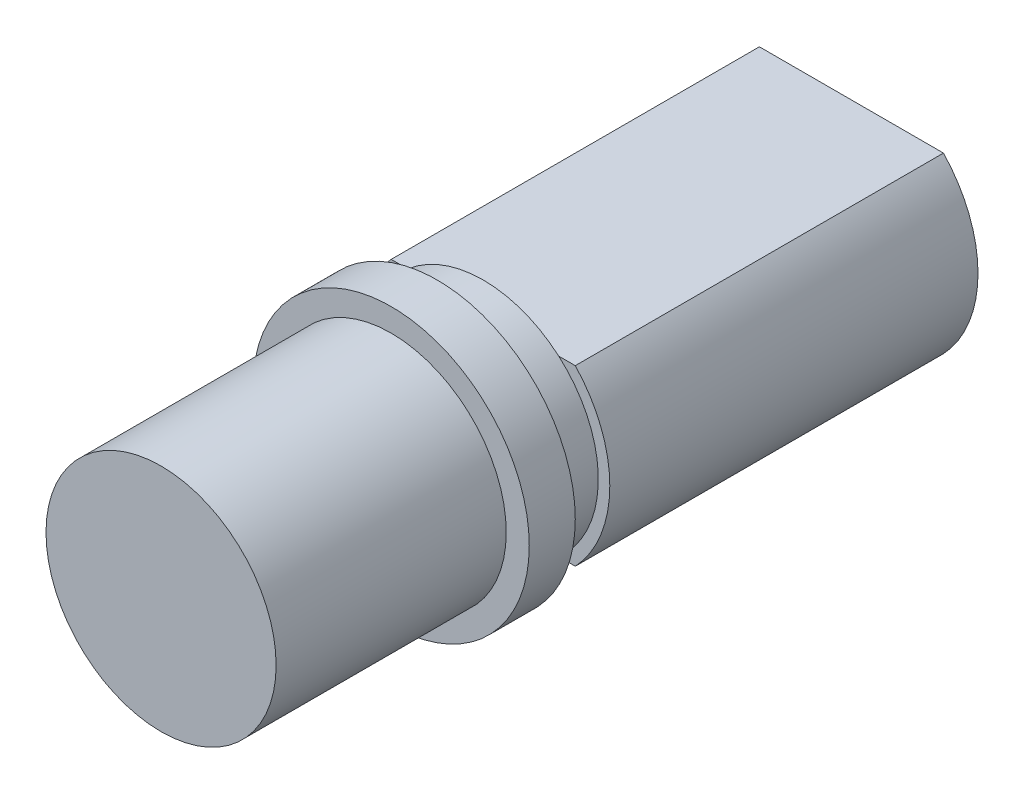
ISO-10303-21;
HEADER;
FILE_DESCRIPTION(('STEP AP214'),'2;1');
FILE_NAME('part.step','',(''),(''),'','','');
FILE_SCHEMA(('AUTOMOTIVE_DESIGN { 1 0 10303 214 1 1 1 1 }'));
ENDSEC;
DATA;
#1=APPLICATION_CONTEXT('core data for automotive mechanical design processes');
#2=APPLICATION_PROTOCOL_DEFINITION('international standard','automotive_design',2000,#1);
#3=PRODUCT_CONTEXT('',#1,'mechanical');
#4=PRODUCT('Part','Part','',(#3));
#5=PRODUCT_RELATED_PRODUCT_CATEGORY('part','',(#4));
#6=PRODUCT_DEFINITION_FORMATION('','',#4);
#7=PRODUCT_DEFINITION_CONTEXT('part definition',#1,'design');
#8=PRODUCT_DEFINITION('design','',#6,#7);
#9=PRODUCT_DEFINITION_SHAPE('','',#8);
#10=(LENGTH_UNIT() NAMED_UNIT(*) SI_UNIT(.MILLI.,.METRE.));
#11=(NAMED_UNIT(*) PLANE_ANGLE_UNIT() SI_UNIT($,.RADIAN.));
#12=(NAMED_UNIT(*) SI_UNIT($,.STERADIAN.) SOLID_ANGLE_UNIT());
#13=UNCERTAINTY_MEASURE_WITH_UNIT(LENGTH_MEASURE(1.E-05),#10,'distance_accuracy_value','');
#14=(GEOMETRIC_REPRESENTATION_CONTEXT(3) GLOBAL_UNCERTAINTY_ASSIGNED_CONTEXT((#13)) GLOBAL_UNIT_ASSIGNED_CONTEXT((#10,
#11,#12)) REPRESENTATION_CONTEXT('',''));
#15=CARTESIAN_POINT('',(0.,0.,0.));
#16=DIRECTION('',(0.,0.,1.));
#17=DIRECTION('',(1.,0.,0.));
#18=AXIS2_PLACEMENT_3D('',#15,#16,#17);
#19=CARTESIAN_POINT('',(0.,0.,6.2));
#20=DIRECTION('',(0.,0.,-1.));
#21=DIRECTION('',(-1.,0.,0.));
#22=AXIS2_PLACEMENT_3D('',#19,#20,#21);
#23=CYLINDRICAL_SURFACE('',#22,2.5);
#24=CARTESIAN_POINT('',(0.,0.,0.));
#25=DIRECTION('',(0.,0.,1.));
#26=DIRECTION('',(1.,0.,0.));
#27=AXIS2_PLACEMENT_3D('',#24,#25,#26);
#28=CIRCLE('',#27,2.5);
#29=CARTESIAN_POINT('',(1.6393596310755,1.88745860881769,0.));
#30=VERTEX_POINT('',#29);
#31=CARTESIAN_POINT('',(-1.6393596310755,1.88745860881769,0.));
#32=VERTEX_POINT('',#31);
#33=EDGE_CURVE('E124',#30,#32,#28,.T.);
#34=ORIENTED_EDGE('',*,*,#33,.T.);
#35=CARTESIAN_POINT('',(-1.6393596310755,-1.88745860881769,0.));
#36=VERTEX_POINT('',#35);
#37=EDGE_CURVE('E128',#32,#36,#28,.T.);
#38=ORIENTED_EDGE('',*,*,#37,.T.);
#39=CARTESIAN_POINT('',(1.6393596310755,-1.88745860881769,0.));
#40=VERTEX_POINT('',#39);
#41=EDGE_CURVE('E122',#36,#40,#28,.T.);
#42=ORIENTED_EDGE('',*,*,#41,.T.);
#43=EDGE_CURVE('E120',#40,#30,#28,.T.);
#44=ORIENTED_EDGE('',*,*,#43,.T.);
#45=EDGE_LOOP('',(#34,#38,#42,#44));
#46=FACE_BOUND('',#45,.T.);
#47=CARTESIAN_POINT('',(0.,0.,1.));
#48=DIRECTION('',(0.,0.,1.));
#49=DIRECTION('',(1.,0.,0.));
#50=AXIS2_PLACEMENT_3D('',#47,#48,#49);
#51=CIRCLE('',#50,2.5);
#52=CARTESIAN_POINT('',(2.5,0.,1.));
#53=VERTEX_POINT('',#52);
#54=EDGE_CURVE('E11',#53,#53,#51,.T.);
#55=ORIENTED_EDGE('',*,*,#54,.F.);
#56=EDGE_LOOP('',(#55));
#57=FACE_BOUND('',#56,.T.);
#58=ADVANCED_FACE('F39',(#46,#57),#23,.T.);
#59=CARTESIAN_POINT('',(0.,0.,0.));
#60=DIRECTION('',(0.,0.,1.));
#61=DIRECTION('',(1.,0.,0.));
#62=AXIS2_PLACEMENT_3D('',#59,#60,#61);
#63=PLANE('',#62);
#64=DIRECTION('',(1.,0.,0.));
#65=VECTOR('',#64,1.);
#66=CARTESIAN_POINT('',(2.,1.88745860881769,0.));
#67=LINE('',#66,#65);
#68=EDGE_CURVE('E48',#32,#30,#67,.T.);
#69=ORIENTED_EDGE('',*,*,#68,.F.);
#70=ORIENTED_EDGE('',*,*,#33,.F.);
#71=EDGE_LOOP('',(#69,#70));
#72=FACE_BOUND('',#71,.T.);
#73=ADVANCED_FACE('F191',(#72),#63,.F.);
#74=DIRECTION('',(-1.,0.,0.));
#75=VECTOR('',#74,1.);
#76=CARTESIAN_POINT('',(2.,-1.88745860881769,0.));
#77=LINE('',#76,#75);
#78=EDGE_CURVE('E54',#40,#36,#77,.T.);
#79=ORIENTED_EDGE('',*,*,#78,.F.);
#80=ORIENTED_EDGE('',*,*,#41,.F.);
#81=EDGE_LOOP('',(#79,#80));
#82=FACE_BOUND('',#81,.T.);
#83=ADVANCED_FACE('F195',(#82),#63,.F.);
#84=CARTESIAN_POINT('',(0.,0.,0.));
#85=DIRECTION('',(0.,0.,-1.));
#86=DIRECTION('',(-1.,0.,0.));
#87=AXIS2_PLACEMENT_3D('',#84,#85,#86);
#88=PLANE('',#87);
#89=ORIENTED_EDGE('',*,*,#37,.F.);
#90=CARTESIAN_POINT('',(-2.,1.88745860881769,0.));
#91=VERTEX_POINT('',#90);
#92=EDGE_CURVE('E115',#91,#32,#67,.T.);
#93=ORIENTED_EDGE('',*,*,#92,.F.);
#94=CARTESIAN_POINT('',(0.,0.,0.));
#95=DIRECTION('',(0.,0.,-1.));
#96=DIRECTION('',(-1.,0.,0.));
#97=AXIS2_PLACEMENT_3D('',#94,#95,#96);
#98=CIRCLE('',#97,2.75);
#99=CARTESIAN_POINT('',(-2.,-1.88745860881769,0.));
#100=VERTEX_POINT('',#99);
#101=EDGE_CURVE('E141',#100,#91,#98,.T.);
#102=ORIENTED_EDGE('',*,*,#101,.F.);
#103=EDGE_CURVE('E133',#36,#100,#77,.T.);
#104=ORIENTED_EDGE('',*,*,#103,.F.);
#105=EDGE_LOOP('',(#89,#93,#102,#104));
#106=FACE_BOUND('',#105,.T.);
#107=ADVANCED_FACE('F157',(#106),#88,.F.);
#108=CARTESIAN_POINT('',(0.,0.,-8.));
#109=DIRECTION('',(0.,0.,1.));
#110=DIRECTION('',(1.,0.,0.));
#111=AXIS2_PLACEMENT_3D('',#108,#109,#110);
#112=CYLINDRICAL_SURFACE('',#111,2.75);
#113=CARTESIAN_POINT('',(0.,0.,0.));
#114=DIRECTION('',(0.,0.,-1.));
#115=DIRECTION('',(-1.,0.,0.));
#116=AXIS2_PLACEMENT_3D('',#113,#114,#115);
#117=CIRCLE('',#116,2.75);
#118=CARTESIAN_POINT('',(2.,1.88745860881769,0.));
#119=VERTEX_POINT('',#118);
#120=CARTESIAN_POINT('',(2.,-1.88745860881769,0.));
#121=VERTEX_POINT('',#120);
#122=EDGE_CURVE('E119',#119,#121,#117,.T.);
#123=ORIENTED_EDGE('',*,*,#122,.T.);
#124=DIRECTION('',(0.,0.,1.));
#125=VECTOR('',#124,1.);
#126=CARTESIAN_POINT('',(2.,-1.88745860881769,-8.));
#127=LINE('',#126,#125);
#128=CARTESIAN_POINT('',(2.,-1.88745860881769,-8.));
#129=VERTEX_POINT('',#128);
#130=EDGE_CURVE('E99',#129,#121,#127,.T.);
#131=ORIENTED_EDGE('',*,*,#130,.F.);
#132=CARTESIAN_POINT('',(0.,0.,-8.));
#133=DIRECTION('',(0.,0.,-1.));
#134=DIRECTION('',(-1.,0.,0.));
#135=AXIS2_PLACEMENT_3D('',#132,#133,#134);
#136=CIRCLE('',#135,2.75);
#137=CARTESIAN_POINT('',(2.,1.88745860881769,-8.));
#138=VERTEX_POINT('',#137);
#139=EDGE_CURVE('E106',#138,#129,#136,.T.);
#140=ORIENTED_EDGE('',*,*,#139,.F.);
#141=DIRECTION('',(0.,0.,1.));
#142=VECTOR('',#141,1.);
#143=CARTESIAN_POINT('',(2.,1.88745860881769,-8.));
#144=LINE('',#143,#142);
#145=EDGE_CURVE('E148',#138,#119,#144,.T.);
#146=ORIENTED_EDGE('',*,*,#145,.T.);
#147=EDGE_LOOP('',(#123,#131,#140,#146));
#148=FACE_BOUND('',#147,.T.);
#149=ADVANCED_FACE('F117',(#148),#112,.T.);
#150=CARTESIAN_POINT('',(2.,-1.88745860881769,-8.));
#151=DIRECTION('',(0.,1.,0.));
#152=DIRECTION('',(0.,0.,1.));
#153=AXIS2_PLACEMENT_3D('',#150,#151,#152);
#154=PLANE('',#153);
#155=EDGE_CURVE('E132',#121,#40,#77,.T.);
#156=ORIENTED_EDGE('',*,*,#155,.T.);
#157=ORIENTED_EDGE('',*,*,#78,.T.);
#158=ORIENTED_EDGE('',*,*,#103,.T.);
#159=DIRECTION('',(0.,0.,1.));
#160=VECTOR('',#159,1.);
#161=CARTESIAN_POINT('',(-2.,-1.88745860881769,-8.));
#162=LINE('',#161,#160);
#163=CARTESIAN_POINT('',(-2.,-1.88745860881769,-8.));
#164=VERTEX_POINT('',#163);
#165=EDGE_CURVE('E102',#164,#100,#162,.T.);
#166=ORIENTED_EDGE('',*,*,#165,.F.);
#167=DIRECTION('',(-1.,0.,0.));
#168=VECTOR('',#167,1.);
#169=CARTESIAN_POINT('',(2.,-1.88745860881769,-8.));
#170=LINE('',#169,#168);
#171=EDGE_CURVE('E94',#129,#164,#170,.T.);
#172=ORIENTED_EDGE('',*,*,#171,.F.);
#173=ORIENTED_EDGE('',*,*,#130,.T.);
#174=EDGE_LOOP('',(#156,#157,#158,#166,#172,#173));
#175=FACE_BOUND('',#174,.T.);
#176=ADVANCED_FACE('F97',(#175),#154,.F.);
#177=CARTESIAN_POINT('',(0.,0.,-8.));
#178=DIRECTION('',(0.,0.,1.));
#179=DIRECTION('',(1.,0.,0.));
#180=AXIS2_PLACEMENT_3D('',#177,#178,#179);
#181=CYLINDRICAL_SURFACE('',#180,2.75);
#182=ORIENTED_EDGE('',*,*,#101,.T.);
#183=DIRECTION('',(0.,0.,1.));
#184=VECTOR('',#183,1.);
#185=CARTESIAN_POINT('',(-2.,1.88745860881769,-8.));
#186=LINE('',#185,#184);
#187=CARTESIAN_POINT('',(-2.,1.88745860881769,-8.));
#188=VERTEX_POINT('',#187);
#189=EDGE_CURVE('E125',#188,#91,#186,.T.);
#190=ORIENTED_EDGE('',*,*,#189,.F.);
#191=CARTESIAN_POINT('',(0.,0.,-8.));
#192=DIRECTION('',(0.,0.,-1.));
#193=DIRECTION('',(-1.,0.,0.));
#194=AXIS2_PLACEMENT_3D('',#191,#192,#193);
#195=CIRCLE('',#194,2.75);
#196=EDGE_CURVE('E105',#164,#188,#195,.T.);
#197=ORIENTED_EDGE('',*,*,#196,.F.);
#198=ORIENTED_EDGE('',*,*,#165,.T.);
#199=EDGE_LOOP('',(#182,#190,#197,#198));
#200=FACE_BOUND('',#199,.T.);
#201=ADVANCED_FACE('F158',(#200),#181,.T.);
#202=CARTESIAN_POINT('',(2.,1.88745860881769,-8.));
#203=DIRECTION('',(0.,-1.,0.));
#204=DIRECTION('',(0.,0.,-1.));
#205=AXIS2_PLACEMENT_3D('',#202,#203,#204);
#206=PLANE('',#205);
#207=ORIENTED_EDGE('',*,*,#92,.T.);
#208=ORIENTED_EDGE('',*,*,#68,.T.);
#209=EDGE_CURVE('E140',#30,#119,#67,.T.);
#210=ORIENTED_EDGE('',*,*,#209,.T.);
#211=ORIENTED_EDGE('',*,*,#145,.F.);
#212=DIRECTION('',(1.,0.,0.));
#213=VECTOR('',#212,1.);
#214=CARTESIAN_POINT('',(2.,1.88745860881769,-8.));
#215=LINE('',#214,#213);
#216=EDGE_CURVE('E111',#188,#138,#215,.T.);
#217=ORIENTED_EDGE('',*,*,#216,.F.);
#218=ORIENTED_EDGE('',*,*,#189,.T.);
#219=EDGE_LOOP('',(#207,#208,#210,#211,#217,#218));
#220=FACE_BOUND('',#219,.T.);
#221=ADVANCED_FACE('F153',(#220),#206,.F.);
#222=CARTESIAN_POINT('',(0.,0.,-8.));
#223=DIRECTION('',(0.,0.,-1.));
#224=DIRECTION('',(-1.,0.,0.));
#225=AXIS2_PLACEMENT_3D('',#222,#223,#224);
#226=PLANE('',#225);
#227=ORIENTED_EDGE('',*,*,#139,.T.);
#228=ORIENTED_EDGE('',*,*,#171,.T.);
#229=ORIENTED_EDGE('',*,*,#196,.T.);
#230=ORIENTED_EDGE('',*,*,#216,.T.);
#231=EDGE_LOOP('',(#227,#228,#229,#230));
#232=FACE_BOUND('',#231,.T.);
#233=ADVANCED_FACE('F109',(#232),#226,.T.);
#234=ORIENTED_EDGE('',*,*,#43,.F.);
#235=ORIENTED_EDGE('',*,*,#155,.F.);
#236=ORIENTED_EDGE('',*,*,#122,.F.);
#237=ORIENTED_EDGE('',*,*,#209,.F.);
#238=EDGE_LOOP('',(#234,#235,#236,#237));
#239=FACE_BOUND('',#238,.T.);
#240=ADVANCED_FACE('F139',(#239),#88,.F.);
#241=CARTESIAN_POINT('',(0.,0.,2.));
#242=DIRECTION('',(0.,0.,-1.));
#243=DIRECTION('',(-1.,0.,0.));
#244=AXIS2_PLACEMENT_3D('',#241,#242,#243);
#245=CYLINDRICAL_SURFACE('',#244,3.);
#246=CARTESIAN_POINT('',(0.,0.,2.));
#247=DIRECTION('',(0.,0.,1.));
#248=DIRECTION('',(1.,0.,0.));
#249=AXIS2_PLACEMENT_3D('',#246,#247,#248);
#250=CIRCLE('',#249,3.);
#251=CARTESIAN_POINT('',(3.,0.,2.));
#252=VERTEX_POINT('',#251);
#253=EDGE_CURVE('E167',#252,#252,#250,.T.);
#254=ORIENTED_EDGE('',*,*,#253,.F.);
#255=EDGE_LOOP('',(#254));
#256=FACE_BOUND('',#255,.T.);
#257=CARTESIAN_POINT('',(0.,0.,1.));
#258=DIRECTION('',(0.,0.,1.));
#259=DIRECTION('',(1.,0.,0.));
#260=AXIS2_PLACEMENT_3D('',#257,#258,#259);
#261=CIRCLE('',#260,3.);
#262=CARTESIAN_POINT('',(3.,0.,1.));
#263=VERTEX_POINT('',#262);
#264=EDGE_CURVE('E164',#263,#263,#261,.T.);
#265=ORIENTED_EDGE('',*,*,#264,.T.);
#266=EDGE_LOOP('',(#265));
#267=FACE_BOUND('',#266,.T.);
#268=ADVANCED_FACE('F179',(#256,#267),#245,.T.);
#269=CARTESIAN_POINT('',(0.,0.,2.));
#270=DIRECTION('',(0.,0.,1.));
#271=DIRECTION('',(1.,0.,0.));
#272=AXIS2_PLACEMENT_3D('',#269,#270,#271);
#273=PLANE('',#272);
#274=CARTESIAN_POINT('',(0.,0.,2.));
#275=DIRECTION('',(0.,0.,1.));
#276=DIRECTION('',(1.,0.,0.));
#277=AXIS2_PLACEMENT_3D('',#274,#275,#276);
#278=CIRCLE('',#277,2.5);
#279=CARTESIAN_POINT('',(-2.5,0.,2.));
#280=VERTEX_POINT('',#279);
#281=EDGE_CURVE('E43',#280,#280,#278,.T.);
#282=ORIENTED_EDGE('',*,*,#281,.F.);
#283=EDGE_LOOP('',(#282));
#284=FACE_BOUND('',#283,.T.);
#285=ORIENTED_EDGE('',*,*,#253,.T.);
#286=EDGE_LOOP('',(#285));
#287=FACE_BOUND('',#286,.T.);
#288=ADVANCED_FACE('F176',(#284,#287),#273,.T.);
#289=CARTESIAN_POINT('',(0.,0.,1.));
#290=DIRECTION('',(0.,0.,1.));
#291=DIRECTION('',(1.,0.,0.));
#292=AXIS2_PLACEMENT_3D('',#289,#290,#291);
#293=PLANE('',#292);
#294=ORIENTED_EDGE('',*,*,#54,.T.);
#295=EDGE_LOOP('',(#294));
#296=FACE_BOUND('',#295,.T.);
#297=ORIENTED_EDGE('',*,*,#264,.F.);
#298=EDGE_LOOP('',(#297));
#299=FACE_BOUND('',#298,.T.);
#300=ADVANCED_FACE('F178',(#296,#299),#293,.F.);
#301=CARTESIAN_POINT('',(0.,0.,7.));
#302=DIRECTION('',(0.,0.,1.));
#303=DIRECTION('',(1.,0.,0.));
#304=AXIS2_PLACEMENT_3D('',#301,#302,#303);
#305=PLANE('',#304);
#306=CARTESIAN_POINT('',(0.,0.,7.));
#307=DIRECTION('',(0.,0.,1.));
#308=DIRECTION('',(1.,0.,0.));
#309=AXIS2_PLACEMENT_3D('',#306,#307,#308);
#310=CIRCLE('',#309,2.5);
#311=CARTESIAN_POINT('',(-2.5,0.,7.));
#312=VERTEX_POINT('',#311);
#313=EDGE_CURVE('E161',#312,#312,#310,.T.);
#314=ORIENTED_EDGE('',*,*,#313,.T.);
#315=EDGE_LOOP('',(#314));
#316=FACE_BOUND('',#315,.T.);
#317=ADVANCED_FACE('F185',(#316),#305,.T.);
#318=CARTESIAN_POINT('',(-2.5,0.,2.));
#319=CARTESIAN_POINT('',(-2.5,0.,2.05208333333333));
#320=CARTESIAN_POINT('',(-2.5,0.,2.10416666666667));
#321=CARTESIAN_POINT('',(-2.5,0.,2.20833333333333));
#322=CARTESIAN_POINT('',(-2.5,0.,2.26041666666667));
#323=CARTESIAN_POINT('',(-2.5,0.,2.36458333333333));
#324=CARTESIAN_POINT('',(-2.5,0.,2.41666666666667));
#325=CARTESIAN_POINT('',(-2.5,0.,2.52083333333333));
#326=CARTESIAN_POINT('',(-2.5,0.,2.57291666666667));
#327=CARTESIAN_POINT('',(-2.5,0.,2.67708333333333));
#328=CARTESIAN_POINT('',(-2.5,0.,2.72916666666667));
#329=CARTESIAN_POINT('',(-2.5,0.,2.83333333333333));
#330=CARTESIAN_POINT('',(-2.5,0.,2.88541666666667));
#331=CARTESIAN_POINT('',(-2.5,0.,2.98958333333333));
#332=CARTESIAN_POINT('',(-2.5,0.,3.04166666666667));
#333=CARTESIAN_POINT('',(-2.5,0.,3.14583333333333));
#334=CARTESIAN_POINT('',(-2.5,0.,3.19791666666667));
#335=CARTESIAN_POINT('',(-2.5,0.,3.30208333333333));
#336=CARTESIAN_POINT('',(-2.5,0.,3.35416666666667));
#337=CARTESIAN_POINT('',(-2.5,0.,3.45833333333333));
#338=CARTESIAN_POINT('',(-2.5,0.,3.51041666666667));
#339=CARTESIAN_POINT('',(-2.5,0.,3.61458333333333));
#340=CARTESIAN_POINT('',(-2.5,0.,3.66666666666667));
#341=CARTESIAN_POINT('',(-2.5,0.,3.77083333333333));
#342=CARTESIAN_POINT('',(-2.5,0.,3.82291666666667));
#343=CARTESIAN_POINT('',(-2.5,0.,3.92708333333333));
#344=CARTESIAN_POINT('',(-2.5,0.,3.97916666666667));
#345=CARTESIAN_POINT('',(-2.5,0.,4.08333333333333));
#346=CARTESIAN_POINT('',(-2.5,0.,4.13541666666667));
#347=CARTESIAN_POINT('',(-2.5,0.,4.23958333333333));
#348=CARTESIAN_POINT('',(-2.5,0.,4.29166666666667));
#349=CARTESIAN_POINT('',(-2.5,0.,4.39583333333333));
#350=CARTESIAN_POINT('',(-2.5,0.,4.44791666666667));
#351=CARTESIAN_POINT('',(-2.5,0.,4.55208333333333));
#352=CARTESIAN_POINT('',(-2.5,0.,4.60416666666667));
#353=CARTESIAN_POINT('',(-2.5,0.,4.70833333333333));
#354=CARTESIAN_POINT('',(-2.5,0.,4.76041666666667));
#355=CARTESIAN_POINT('',(-2.5,0.,4.86458333333333));
#356=CARTESIAN_POINT('',(-2.5,0.,4.91666666666667));
#357=CARTESIAN_POINT('',(-2.5,0.,5.02083333333333));
#358=CARTESIAN_POINT('',(-2.5,0.,5.07291666666667));
#359=CARTESIAN_POINT('',(-2.5,0.,5.17708333333333));
#360=CARTESIAN_POINT('',(-2.5,0.,5.22916666666667));
#361=CARTESIAN_POINT('',(-2.5,0.,5.33333333333333));
#362=CARTESIAN_POINT('',(-2.5,0.,5.38541666666667));
#363=CARTESIAN_POINT('',(-2.5,0.,5.48958333333333));
#364=CARTESIAN_POINT('',(-2.5,0.,5.54166666666667));
#365=CARTESIAN_POINT('',(-2.5,0.,5.64583333333333));
#366=CARTESIAN_POINT('',(-2.5,0.,5.69791666666667));
#367=CARTESIAN_POINT('',(-2.5,0.,5.80208333333333));
#368=CARTESIAN_POINT('',(-2.5,0.,5.85416666666667));
#369=CARTESIAN_POINT('',(-2.5,0.,5.95833333333333));
#370=CARTESIAN_POINT('',(-2.5,0.,6.01041666666667));
#371=CARTESIAN_POINT('',(-2.5,0.,6.11458333333333));
#372=CARTESIAN_POINT('',(-2.5,0.,6.16666666666667));
#373=CARTESIAN_POINT('',(-2.5,0.,6.27083333333333));
#374=CARTESIAN_POINT('',(-2.5,0.,6.32291666666667));
#375=CARTESIAN_POINT('',(-2.5,0.,6.42708333333333));
#376=CARTESIAN_POINT('',(-2.5,0.,6.47916666666667));
#377=CARTESIAN_POINT('',(-2.5,0.,6.58333333333333));
#378=CARTESIAN_POINT('',(-2.5,0.,6.63541666666667));
#379=CARTESIAN_POINT('',(-2.5,0.,6.73958333333333));
#380=CARTESIAN_POINT('',(-2.5,0.,6.79166666666667));
#381=CARTESIAN_POINT('',(-2.5,0.,6.89583333333333));
#382=CARTESIAN_POINT('',(-2.5,0.,6.94791666666667));
#383=CARTESIAN_POINT('',(-2.5,0.,7.));
#384=B_SPLINE_CURVE_WITH_KNOTS('',3,(#318,#319,#320,#321,#322,#323,#324,#325,#326,#327,#328,
#329,#330,#331,#332,#333,#334,#335,#336,#337,#338,#339,#340,#341,#342,#343,#344,#345,#346,#347,
#348,#349,#350,#351,#352,#353,#354,#355,#356,#357,#358,#359,#360,#361,#362,#363,#364,#365,#366,
#367,#368,#369,#370,#371,#372,#373,#374,#375,#376,#377,#378,#379,#380,#381,#382,#383),
.UNSPECIFIED.,.F.,.F.,(4,2,2,2,2,2,2,2,2,2,2,2,2,2,2,2,2,2,2,2,2,2,2,2,2,2,2,2,2,2,2,2,4),(0.,
0.15625,0.3125,0.46875,0.625,0.78125,0.9375,1.09375,1.25,1.40625,1.5625,1.71875,1.875,2.03125,
2.1875,2.34375,2.5,2.65625,2.8125,2.96875,3.125,3.28125,3.4375,3.59375,3.75,3.90625,4.0625,
4.21875,4.375,4.53125,4.6875,4.84375,5.),.UNSPECIFIED.);
#385=EDGE_CURVE('BSEAM41',#280,#312,#384,.T.);
#386=ORIENTED_EDGE('',*,*,#281,.T.);
#387=ORIENTED_EDGE('',*,*,#313,.F.);
#388=ORIENTED_EDGE('',*,*,#385,.T.);
#389=ORIENTED_EDGE('',*,*,#385,.F.);
#390=EDGE_LOOP('',(#386,#388,#387,#389));
#391=FACE_BOUND('',#390,.T.);
#392=ADVANCED_FACE('F41',(#391),#23,.T.);
#393=CLOSED_SHELL('',(#58,#73,#83,#107,#149,#176,#201,#221,#233,#240,#268,#288,#300,#317,#392));
#394=MANIFOLD_SOLID_BREP('B2',#393);
#395=ADVANCED_BREP_SHAPE_REPRESENTATION('',(#18,#394),#14);
#396=SHAPE_DEFINITION_REPRESENTATION(#9,#395);
ENDSEC;
END-ISO-10303-21;
